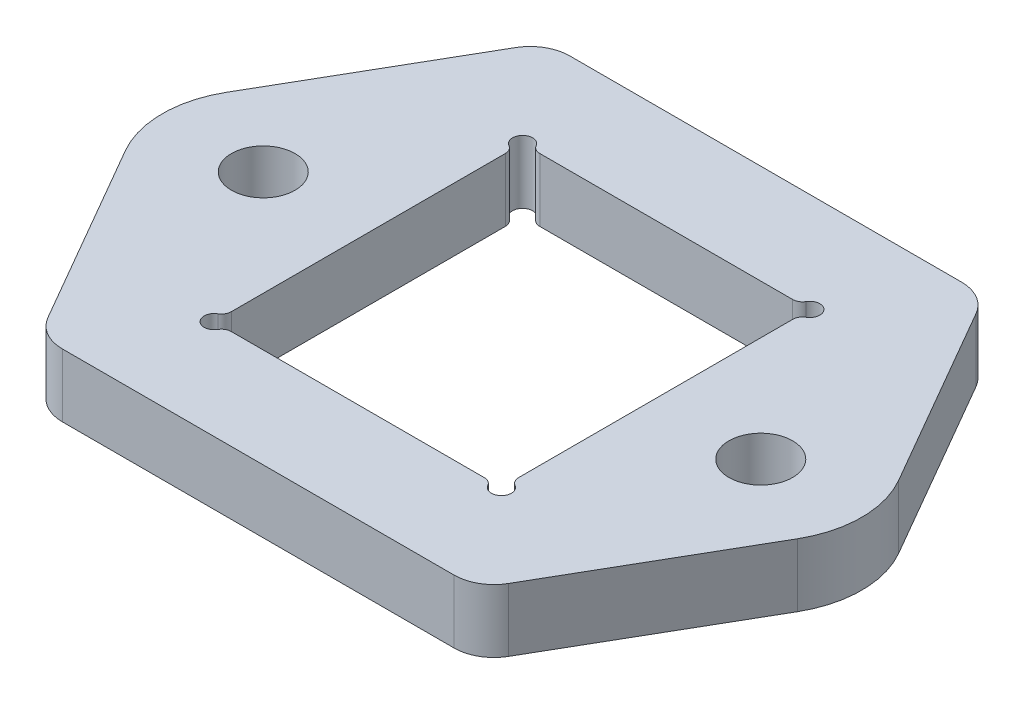
ISO-10303-21;
HEADER;
FILE_DESCRIPTION(('STEP AP214'),'2;1');
FILE_NAME('part.step','',(''),(''),'','','');
FILE_SCHEMA(('AUTOMOTIVE_DESIGN { 1 0 10303 214 1 1 1 1 }'));
ENDSEC;
DATA;
#1=APPLICATION_CONTEXT('core data for automotive mechanical design processes');
#2=APPLICATION_PROTOCOL_DEFINITION('international standard','automotive_design',2000,#1);
#3=PRODUCT_CONTEXT('',#1,'mechanical');
#4=PRODUCT('Part','Part','',(#3));
#5=PRODUCT_RELATED_PRODUCT_CATEGORY('part','',(#4));
#6=PRODUCT_DEFINITION_FORMATION('','',#4);
#7=PRODUCT_DEFINITION_CONTEXT('part definition',#1,'design');
#8=PRODUCT_DEFINITION('design','',#6,#7);
#9=PRODUCT_DEFINITION_SHAPE('','',#8);
#10=(LENGTH_UNIT() NAMED_UNIT(*) SI_UNIT(.MILLI.,.METRE.));
#11=(NAMED_UNIT(*) PLANE_ANGLE_UNIT() SI_UNIT($,.RADIAN.));
#12=(NAMED_UNIT(*) SI_UNIT($,.STERADIAN.) SOLID_ANGLE_UNIT());
#13=UNCERTAINTY_MEASURE_WITH_UNIT(LENGTH_MEASURE(1.E-05),#10,'distance_accuracy_value','');
#14=(GEOMETRIC_REPRESENTATION_CONTEXT(3) GLOBAL_UNCERTAINTY_ASSIGNED_CONTEXT((#13)) GLOBAL_UNIT_ASSIGNED_CONTEXT((#10,
#11,#12)) REPRESENTATION_CONTEXT('',''));
#15=CARTESIAN_POINT('',(0.,0.,0.));
#16=DIRECTION('',(0.,0.,1.));
#17=DIRECTION('',(1.,0.,0.));
#18=AXIS2_PLACEMENT_3D('',#15,#16,#17);
#19=CARTESIAN_POINT('',(-17.5704604773524,1.81803097578364,7.75));
#20=DIRECTION('',(0.,1.,0.));
#21=DIRECTION('',(0.,0.,1.));
#22=AXIS2_PLACEMENT_3D('',#19,#20,#21);
#23=PLANE('',#22);
#24=CARTESIAN_POINT('',(-12.5,1.81803097578364,0.));
#25=DIRECTION('',(0.,1.,0.));
#26=DIRECTION('',(0.,0.,1.));
#27=AXIS2_PLACEMENT_3D('',#24,#25,#26);
#28=CIRCLE('',#27,1.59999999999999);
#29=CARTESIAN_POINT('',(-12.5,1.81803097578364,1.59999999999999));
#30=VERTEX_POINT('',#29);
#31=EDGE_CURVE('E294',#30,#30,#28,.T.);
#32=ORIENTED_EDGE('',*,*,#31,.F.);
#33=EDGE_LOOP('',(#32));
#34=FACE_BOUND('',#33,.T.);
#35=CARTESIAN_POINT('',(12.5,1.81803097578364,0.));
#36=DIRECTION('',(0.,1.,0.));
#37=DIRECTION('',(0.,0.,1.));
#38=AXIS2_PLACEMENT_3D('',#35,#36,#37);
#39=CIRCLE('',#38,1.59999999999999);
#40=CARTESIAN_POINT('',(12.5,1.81803097578364,1.59999999999998));
#41=VERTEX_POINT('',#40);
#42=EDGE_CURVE('E309',#41,#41,#39,.T.);
#43=ORIENTED_EDGE('',*,*,#42,.F.);
#44=EDGE_LOOP('',(#43));
#45=FACE_BOUND('',#44,.T.);
#46=DIRECTION('',(0.,0.,-1.));
#47=VECTOR('',#46,1.);
#48=CARTESIAN_POINT('',(-7.21865631813423,1.81803097578364,7.75));
#49=LINE('',#48,#47);
#50=CARTESIAN_POINT('',(-7.21865631813423,1.81803097578364,6.88397459621556));
#51=VERTEX_POINT('',#50);
#52=CARTESIAN_POINT('',(-7.21865631813423,1.81803097578364,-6.88397459621556));
#53=VERTEX_POINT('',#52);
#54=EDGE_CURVE('E430',#51,#53,#49,.T.);
#55=ORIENTED_EDGE('',*,*,#54,.T.);
#56=CARTESIAN_POINT('',(-7.71865631813423,1.81803097578364,-6.88397459621556));
#57=DIRECTION('',(0.,-1.,0.));
#58=DIRECTION('',(0.,0.,-1.));
#59=AXIS2_PLACEMENT_3D('',#56,#57,#58);
#60=CIRCLE('',#59,0.5);
#61=CARTESIAN_POINT('',(-7.46865631813423,1.81803097578364,-7.31698729810778));
#62=VERTEX_POINT('',#61);
#63=EDGE_CURVE('E349',#62,#53,#60,.T.);
#64=ORIENTED_EDGE('',*,*,#63,.F.);
#65=CARTESIAN_POINT('',(-7.21865631813424,1.81803097578364,-7.75));
#66=DIRECTION('',(0.,-1.,0.));
#67=DIRECTION('',(0.,0.,-1.));
#68=AXIS2_PLACEMENT_3D('',#65,#66,#67);
#69=CIRCLE('',#68,0.5);
#70=CARTESIAN_POINT('',(-6.78564361624202,1.81803097578364,-8.));
#71=VERTEX_POINT('',#70);
#72=EDGE_CURVE('E318',#62,#71,#69,.T.);
#73=ORIENTED_EDGE('',*,*,#72,.T.);
#74=CARTESIAN_POINT('',(-6.3526309143498,1.81803097578364,-8.25));
#75=DIRECTION('',(0.,-1.,0.));
#76=DIRECTION('',(0.,0.,-1.));
#77=AXIS2_PLACEMENT_3D('',#74,#75,#76);
#78=CIRCLE('',#77,0.5);
#79=CARTESIAN_POINT('',(-6.3526309143498,1.81803097578364,-7.75));
#80=VERTEX_POINT('',#79);
#81=EDGE_CURVE('E345',#80,#71,#78,.T.);
#82=ORIENTED_EDGE('',*,*,#81,.F.);
#83=DIRECTION('',(-1.,0.,0.));
#84=VECTOR('',#83,1.);
#85=CARTESIAN_POINT('',(-17.5704604773524,1.81803097578364,-7.75));
#86=LINE('',#85,#84);
#87=CARTESIAN_POINT('',(6.3526309143498,1.81803097578364,-7.75));
#88=VERTEX_POINT('',#87);
#89=EDGE_CURVE('E337',#88,#80,#86,.T.);
#90=ORIENTED_EDGE('',*,*,#89,.F.);
#91=CARTESIAN_POINT('',(6.3526309143498,1.81803097578364,-8.25));
#92=DIRECTION('',(0.,-1.,0.));
#93=DIRECTION('',(0.,0.,-1.));
#94=AXIS2_PLACEMENT_3D('',#91,#92,#93);
#95=CIRCLE('',#94,0.5);
#96=CARTESIAN_POINT('',(6.78564361624202,1.81803097578364,-8.));
#97=VERTEX_POINT('',#96);
#98=EDGE_CURVE('E353',#97,#88,#95,.T.);
#99=ORIENTED_EDGE('',*,*,#98,.F.);
#100=CARTESIAN_POINT('',(7.21865631813423,1.81803097578364,-7.75));
#101=DIRECTION('',(0.,-1.,0.));
#102=DIRECTION('',(0.,0.,-1.));
#103=AXIS2_PLACEMENT_3D('',#100,#101,#102);
#104=CIRCLE('',#103,0.5);
#105=CARTESIAN_POINT('',(7.46865631813424,1.81803097578364,-7.31698729810778));
#106=VERTEX_POINT('',#105);
#107=EDGE_CURVE('E317',#97,#106,#104,.T.);
#108=ORIENTED_EDGE('',*,*,#107,.T.);
#109=CARTESIAN_POINT('',(7.71865631813424,1.81803097578364,-6.88397459621556));
#110=DIRECTION('',(0.,-1.,0.));
#111=DIRECTION('',(0.,0.,-1.));
#112=AXIS2_PLACEMENT_3D('',#109,#110,#111);
#113=CIRCLE('',#112,0.5);
#114=CARTESIAN_POINT('',(7.21865631813423,1.81803097578364,-6.88397459621556));
#115=VERTEX_POINT('',#114);
#116=EDGE_CURVE('E356',#115,#106,#113,.T.);
#117=ORIENTED_EDGE('',*,*,#116,.F.);
#118=DIRECTION('',(0.,0.,-1.));
#119=VECTOR('',#118,1.);
#120=CARTESIAN_POINT('',(7.21865631813423,1.81803097578364,7.75));
#121=LINE('',#120,#119);
#122=CARTESIAN_POINT('',(7.21865631813423,1.81803097578364,6.88397459621556));
#123=VERTEX_POINT('',#122);
#124=EDGE_CURVE('E409',#123,#115,#121,.T.);
#125=ORIENTED_EDGE('',*,*,#124,.F.);
#126=CARTESIAN_POINT('',(7.71865631813424,1.81803097578364,6.88397459621556));
#127=DIRECTION('',(0.,1.,0.));
#128=DIRECTION('',(0.,0.,1.));
#129=AXIS2_PLACEMENT_3D('',#126,#127,#128);
#130=CIRCLE('',#129,0.5);
#131=CARTESIAN_POINT('',(7.46865631813424,1.81803097578364,7.31698729810778));
#132=VERTEX_POINT('',#131);
#133=EDGE_CURVE('E448',#123,#132,#130,.T.);
#134=ORIENTED_EDGE('',*,*,#133,.T.);
#135=CARTESIAN_POINT('',(7.21865631813423,1.81803097578364,7.75));
#136=DIRECTION('',(0.,1.,0.));
#137=DIRECTION('',(0.,0.,1.));
#138=AXIS2_PLACEMENT_3D('',#135,#136,#137);
#139=CIRCLE('',#138,0.5);
#140=CARTESIAN_POINT('',(6.78564361624202,1.81803097578364,8.));
#141=VERTEX_POINT('',#140);
#142=EDGE_CURVE('E399',#141,#132,#139,.T.);
#143=ORIENTED_EDGE('',*,*,#142,.F.);
#144=CARTESIAN_POINT('',(6.3526309143498,1.81803097578364,8.25));
#145=DIRECTION('',(0.,1.,0.));
#146=DIRECTION('',(0.,0.,1.));
#147=AXIS2_PLACEMENT_3D('',#144,#145,#146);
#148=CIRCLE('',#147,0.5);
#149=CARTESIAN_POINT('',(6.3526309143498,1.81803097578364,7.75));
#150=VERTEX_POINT('',#149);
#151=EDGE_CURVE('E445',#141,#150,#148,.T.);
#152=ORIENTED_EDGE('',*,*,#151,.T.);
#153=DIRECTION('',(-1.,0.,0.));
#154=VECTOR('',#153,1.);
#155=CARTESIAN_POINT('',(-17.5704604773524,1.81803097578364,7.75));
#156=LINE('',#155,#154);
#157=CARTESIAN_POINT('',(-6.3526309143498,1.81803097578364,7.75));
#158=VERTEX_POINT('',#157);
#159=EDGE_CURVE('E425',#150,#158,#156,.T.);
#160=ORIENTED_EDGE('',*,*,#159,.T.);
#161=CARTESIAN_POINT('',(-6.3526309143498,1.81803097578364,8.25));
#162=DIRECTION('',(0.,1.,0.));
#163=DIRECTION('',(0.,0.,1.));
#164=AXIS2_PLACEMENT_3D('',#161,#162,#163);
#165=CIRCLE('',#164,0.5);
#166=CARTESIAN_POINT('',(-6.78564361624202,1.81803097578364,8.));
#167=VERTEX_POINT('',#166);
#168=EDGE_CURVE('E439',#158,#167,#165,.T.);
#169=ORIENTED_EDGE('',*,*,#168,.T.);
#170=CARTESIAN_POINT('',(-7.21865631813424,1.81803097578364,7.75));
#171=DIRECTION('',(0.,1.,0.));
#172=DIRECTION('',(0.,0.,1.));
#173=AXIS2_PLACEMENT_3D('',#170,#171,#172);
#174=CIRCLE('',#173,0.5);
#175=CARTESIAN_POINT('',(-7.46865631813423,1.81803097578364,7.31698729810778));
#176=VERTEX_POINT('',#175);
#177=EDGE_CURVE('E400',#176,#167,#174,.T.);
#178=ORIENTED_EDGE('',*,*,#177,.F.);
#179=CARTESIAN_POINT('',(-7.71865631813423,1.81803097578364,6.88397459621556));
#180=DIRECTION('',(0.,1.,0.));
#181=DIRECTION('',(0.,0.,1.));
#182=AXIS2_PLACEMENT_3D('',#179,#180,#181);
#183=CIRCLE('',#182,0.5);
#184=EDGE_CURVE('E442',#176,#51,#183,.T.);
#185=ORIENTED_EDGE('',*,*,#184,.T.);
#186=EDGE_LOOP('',(#55,#64,#73,#82,#90,#99,#108,#117,#125,#134,#143,#152,#160,#169,#178,#185));
#187=FACE_BOUND('',#186,.T.);
#188=DIRECTION('',(-1.,0.,0.));
#189=VECTOR('',#188,1.);
#190=CARTESIAN_POINT('',(-10.9936475108618,1.81803097578364,-12.75));
#191=LINE('',#190,#189);
#192=CARTESIAN_POINT('',(9.8389469724826,1.81803097578364,-12.75));
#193=VERTEX_POINT('',#192);
#194=CARTESIAN_POINT('',(-9.83894697248251,1.81803097578364,-12.75));
#195=VERTEX_POINT('',#194);
#196=EDGE_CURVE('E288',#193,#195,#191,.T.);
#197=ORIENTED_EDGE('',*,*,#196,.T.);
#198=CARTESIAN_POINT('',(-9.83894697248251,1.81803097578364,-10.75));
#199=DIRECTION('',(0.,1.,0.));
#200=DIRECTION('',(0.,0.,1.));
#201=AXIS2_PLACEMENT_3D('',#198,#199,#200);
#202=CIRCLE('',#201,2.);
#203=CARTESIAN_POINT('',(-11.5709977800514,1.81803097578364,-11.75));
#204=VERTEX_POINT('',#203);
#205=EDGE_CURVE('E503',#195,#204,#202,.T.);
#206=ORIENTED_EDGE('',*,*,#205,.T.);
#207=DIRECTION('',(-0.500000000000004,0.,0.866025403784436));
#208=VECTOR('',#207,1.);
#209=CARTESIAN_POINT('',(-10.9936475108618,1.81803097578364,-12.75));
#210=LINE('',#209,#208);
#211=CARTESIAN_POINT('',(-16.8911475822722,1.81803097578364,-2.53523023867622));
#212=VERTEX_POINT('',#211);
#213=EDGE_CURVE('E265',#204,#212,#210,.T.);
#214=ORIENTED_EDGE('',*,*,#213,.T.);
#215=CARTESIAN_POINT('',(-12.5,1.81803097578364,0.));
#216=DIRECTION('',(0.,1.,0.));
#217=DIRECTION('',(0.,0.,1.));
#218=AXIS2_PLACEMENT_3D('',#215,#216,#217);
#219=CIRCLE('',#218,5.07046047735241);
#220=CARTESIAN_POINT('',(-16.8911475822722,1.81803097578364,2.53523023867623));
#221=VERTEX_POINT('',#220);
#222=EDGE_CURVE('E268',#212,#221,#219,.T.);
#223=ORIENTED_EDGE('',*,*,#222,.T.);
#224=DIRECTION('',(0.500000000000005,0.,0.866025403784436));
#225=VECTOR('',#224,1.);
#226=CARTESIAN_POINT('',(-10.9936475108617,1.81803097578364,12.75));
#227=LINE('',#226,#225);
#228=CARTESIAN_POINT('',(-11.5709977800514,1.81803097578364,11.75));
#229=VERTEX_POINT('',#228);
#230=EDGE_CURVE('E271',#221,#229,#227,.T.);
#231=ORIENTED_EDGE('',*,*,#230,.T.);
#232=CARTESIAN_POINT('',(-9.8389469724825,1.81803097578364,10.75));
#233=DIRECTION('',(0.,1.,0.));
#234=DIRECTION('',(0.,0.,1.));
#235=AXIS2_PLACEMENT_3D('',#232,#233,#234);
#236=CIRCLE('',#235,2.);
#237=CARTESIAN_POINT('',(-9.8389469724825,1.81803097578364,12.75));
#238=VERTEX_POINT('',#237);
#239=EDGE_CURVE('E494',#229,#238,#236,.T.);
#240=ORIENTED_EDGE('',*,*,#239,.T.);
#241=DIRECTION('',(1.,0.,0.));
#242=VECTOR('',#241,1.);
#243=CARTESIAN_POINT('',(-10.9936475108617,1.81803097578364,12.75));
#244=LINE('',#243,#242);
#245=CARTESIAN_POINT('',(9.83894697248261,1.81803097578364,12.75));
#246=VERTEX_POINT('',#245);
#247=EDGE_CURVE('E275',#238,#246,#244,.T.);
#248=ORIENTED_EDGE('',*,*,#247,.T.);
#249=CARTESIAN_POINT('',(9.8389469724826,1.81803097578364,10.75));
#250=DIRECTION('',(0.,1.,0.));
#251=DIRECTION('',(0.,0.,1.));
#252=AXIS2_PLACEMENT_3D('',#249,#250,#251);
#253=CIRCLE('',#252,2.);
#254=CARTESIAN_POINT('',(11.5709977800515,1.81803097578364,11.75));
#255=VERTEX_POINT('',#254);
#256=EDGE_CURVE('E497',#246,#255,#253,.T.);
#257=ORIENTED_EDGE('',*,*,#256,.T.);
#258=DIRECTION('',(0.499999999999997,0.,-0.86602540378444));
#259=VECTOR('',#258,1.);
#260=CARTESIAN_POINT('',(10.9936475108619,1.81803097578364,12.75));
#261=LINE('',#260,#259);
#262=CARTESIAN_POINT('',(16.8911475822722,1.81803097578364,2.53523023867619));
#263=VERTEX_POINT('',#262);
#264=EDGE_CURVE('E279',#255,#263,#261,.T.);
#265=ORIENTED_EDGE('',*,*,#264,.T.);
#266=CARTESIAN_POINT('',(12.5,1.81803097578364,0.));
#267=DIRECTION('',(0.,1.,0.));
#268=DIRECTION('',(0.,0.,1.));
#269=AXIS2_PLACEMENT_3D('',#266,#267,#268);
#270=CIRCLE('',#269,5.07046047735241);
#271=CARTESIAN_POINT('',(16.8911475822722,1.81803097578364,-2.5352302386762));
#272=VERTEX_POINT('',#271);
#273=EDGE_CURVE('E244',#263,#272,#270,.T.);
#274=ORIENTED_EDGE('',*,*,#273,.T.);
#275=DIRECTION('',(-0.499999999999998,0.,-0.86602540378444));
#276=VECTOR('',#275,1.);
#277=CARTESIAN_POINT('',(10.9936475108619,1.81803097578364,-12.75));
#278=LINE('',#277,#276);
#279=CARTESIAN_POINT('',(11.5709977800515,1.81803097578364,-11.75));
#280=VERTEX_POINT('',#279);
#281=EDGE_CURVE('E284',#272,#280,#278,.T.);
#282=ORIENTED_EDGE('',*,*,#281,.T.);
#283=CARTESIAN_POINT('',(9.8389469724826,1.81803097578364,-10.75));
#284=DIRECTION('',(0.,1.,0.));
#285=DIRECTION('',(0.,0.,1.));
#286=AXIS2_PLACEMENT_3D('',#283,#284,#285);
#287=CIRCLE('',#286,2.);
#288=EDGE_CURVE('E500',#280,#193,#287,.T.);
#289=ORIENTED_EDGE('',*,*,#288,.T.);
#290=EDGE_LOOP('',(#197,#206,#214,#223,#231,#240,#248,#257,#265,#274,#282,#289));
#291=FACE_BOUND('',#290,.T.);
#292=ADVANCED_FACE('F41',(#34,#45,#187,#291),#23,.T.);
#293=CARTESIAN_POINT('',(-7.21865631813423,-1.35696902421636,7.75));
#294=DIRECTION('',(0.,-1.,0.));
#295=DIRECTION('',(1.,0.,0.));
#296=AXIS2_PLACEMENT_3D('',#293,#294,#295);
#297=PLANE('',#296);
#298=CARTESIAN_POINT('',(-12.5,-1.35696902421636,0.));
#299=DIRECTION('',(0.,1.,0.));
#300=DIRECTION('',(0.,0.,1.));
#301=AXIS2_PLACEMENT_3D('',#298,#299,#300);
#302=CIRCLE('',#301,1.6);
#303=CARTESIAN_POINT('',(-12.5,-1.35696902421636,1.6));
#304=VERTEX_POINT('',#303);
#305=EDGE_CURVE('E305',#304,#304,#302,.T.);
#306=ORIENTED_EDGE('',*,*,#305,.T.);
#307=EDGE_LOOP('',(#306));
#308=FACE_BOUND('',#307,.T.);
#309=CARTESIAN_POINT('',(12.5,-1.35696902421636,0.));
#310=DIRECTION('',(0.,1.,0.));
#311=DIRECTION('',(0.,0.,1.));
#312=AXIS2_PLACEMENT_3D('',#309,#310,#311);
#313=CIRCLE('',#312,1.6);
#314=CARTESIAN_POINT('',(12.5,-1.35696902421636,1.59999999999999));
#315=VERTEX_POINT('',#314);
#316=EDGE_CURVE('E313',#315,#315,#313,.T.);
#317=ORIENTED_EDGE('',*,*,#316,.T.);
#318=EDGE_LOOP('',(#317));
#319=FACE_BOUND('',#318,.T.);
#320=CARTESIAN_POINT('',(7.21865631813423,-1.35696902421636,7.75));
#321=DIRECTION('',(0.,-1.,0.));
#322=DIRECTION('',(1.,0.,0.));
#323=AXIS2_PLACEMENT_3D('',#320,#321,#322);
#324=CIRCLE('',#323,0.5);
#325=CARTESIAN_POINT('',(6.78564361624202,-1.35696902421636,8.));
#326=VERTEX_POINT('',#325);
#327=CARTESIAN_POINT('',(7.46865631813424,-1.35696902421636,7.31698729810778));
#328=VERTEX_POINT('',#327);
#329=EDGE_CURVE('E405',#326,#328,#324,.F.);
#330=ORIENTED_EDGE('',*,*,#329,.T.);
#331=CARTESIAN_POINT('',(7.71865631813424,-1.35696902421636,6.88397459621556));
#332=DIRECTION('',(0.,-1.,0.));
#333=DIRECTION('',(1.,0.,0.));
#334=AXIS2_PLACEMENT_3D('',#331,#332,#333);
#335=CIRCLE('',#334,0.5);
#336=CARTESIAN_POINT('',(7.21865631813423,-1.35696902421636,6.88397459621556));
#337=VERTEX_POINT('',#336);
#338=EDGE_CURVE('E467',#328,#337,#335,.T.);
#339=ORIENTED_EDGE('',*,*,#338,.T.);
#340=DIRECTION('',(0.,0.,-1.));
#341=VECTOR('',#340,1.);
#342=CARTESIAN_POINT('',(7.21865631813423,-1.35696902421636,7.75));
#343=LINE('',#342,#341);
#344=CARTESIAN_POINT('',(7.21865631813423,-1.35696902421636,-6.88397459621556));
#345=VERTEX_POINT('',#344);
#346=EDGE_CURVE('E418',#337,#345,#343,.T.);
#347=ORIENTED_EDGE('',*,*,#346,.T.);
#348=CARTESIAN_POINT('',(7.71865631813424,-1.35696902421636,-6.88397459621556));
#349=DIRECTION('',(0.,1.,0.));
#350=DIRECTION('',(1.,0.,0.));
#351=AXIS2_PLACEMENT_3D('',#348,#349,#350);
#352=CIRCLE('',#351,0.5);
#353=CARTESIAN_POINT('',(7.46865631813424,-1.35696902421636,-7.31698729810778));
#354=VERTEX_POINT('',#353);
#355=EDGE_CURVE('E377',#354,#345,#352,.T.);
#356=ORIENTED_EDGE('',*,*,#355,.F.);
#357=CARTESIAN_POINT('',(7.21865631813423,-1.35696902421636,-7.75));
#358=DIRECTION('',(0.,1.,0.));
#359=DIRECTION('',(1.,0.,0.));
#360=AXIS2_PLACEMENT_3D('',#357,#358,#359);
#361=CIRCLE('',#360,0.5);
#362=CARTESIAN_POINT('',(6.78564361624202,-1.35696902421636,-8.));
#363=VERTEX_POINT('',#362);
#364=EDGE_CURVE('E323',#363,#354,#361,.F.);
#365=ORIENTED_EDGE('',*,*,#364,.F.);
#366=CARTESIAN_POINT('',(6.3526309143498,-1.35696902421636,-8.25));
#367=DIRECTION('',(0.,1.,0.));
#368=DIRECTION('',(1.,0.,0.));
#369=AXIS2_PLACEMENT_3D('',#366,#367,#368);
#370=CIRCLE('',#369,0.5);
#371=CARTESIAN_POINT('',(6.3526309143498,-1.35696902421636,-7.75));
#372=VERTEX_POINT('',#371);
#373=EDGE_CURVE('E373',#372,#363,#370,.T.);
#374=ORIENTED_EDGE('',*,*,#373,.F.);
#375=DIRECTION('',(1.,0.,0.));
#376=VECTOR('',#375,1.);
#377=CARTESIAN_POINT('',(-17.5704604773524,-1.35696902421636,-7.75));
#378=LINE('',#377,#376);
#379=CARTESIAN_POINT('',(-6.3526309143498,-1.35696902421636,-7.75));
#380=VERTEX_POINT('',#379);
#381=EDGE_CURVE('E327',#380,#372,#378,.T.);
#382=ORIENTED_EDGE('',*,*,#381,.F.);
#383=CARTESIAN_POINT('',(-6.3526309143498,-1.35696902421636,-8.25));
#384=DIRECTION('',(0.,1.,0.));
#385=DIRECTION('',(1.,0.,0.));
#386=AXIS2_PLACEMENT_3D('',#383,#384,#385);
#387=CIRCLE('',#386,0.5);
#388=CARTESIAN_POINT('',(-6.78564361624202,-1.35696902421636,-8.));
#389=VERTEX_POINT('',#388);
#390=EDGE_CURVE('E366',#389,#380,#387,.T.);
#391=ORIENTED_EDGE('',*,*,#390,.F.);
#392=CARTESIAN_POINT('',(-7.21865631813424,-1.35696902421636,-7.75));
#393=DIRECTION('',(0.,1.,0.));
#394=DIRECTION('',(1.,0.,0.));
#395=AXIS2_PLACEMENT_3D('',#392,#393,#394);
#396=CIRCLE('',#395,0.5);
#397=CARTESIAN_POINT('',(-7.46865631813423,-1.35696902421636,-7.31698729810778));
#398=VERTEX_POINT('',#397);
#399=EDGE_CURVE('E322',#398,#389,#396,.F.);
#400=ORIENTED_EDGE('',*,*,#399,.F.);
#401=CARTESIAN_POINT('',(-7.71865631813423,-1.35696902421636,-6.88397459621556));
#402=DIRECTION('',(0.,1.,0.));
#403=DIRECTION('',(1.,0.,0.));
#404=AXIS2_PLACEMENT_3D('',#401,#402,#403);
#405=CIRCLE('',#404,0.5);
#406=CARTESIAN_POINT('',(-7.21865631813423,-1.35696902421636,-6.88397459621556));
#407=VERTEX_POINT('',#406);
#408=EDGE_CURVE('E369',#407,#398,#405,.T.);
#409=ORIENTED_EDGE('',*,*,#408,.F.);
#410=DIRECTION('',(0.,0.,-1.));
#411=VECTOR('',#410,1.);
#412=CARTESIAN_POINT('',(-7.21865631813423,-1.35696902421636,7.75));
#413=LINE('',#412,#411);
#414=CARTESIAN_POINT('',(-7.21865631813423,-1.35696902421636,6.88397459621556));
#415=VERTEX_POINT('',#414);
#416=EDGE_CURVE('E429',#415,#407,#413,.T.);
#417=ORIENTED_EDGE('',*,*,#416,.F.);
#418=CARTESIAN_POINT('',(-7.71865631813423,-1.35696902421636,6.88397459621556));
#419=DIRECTION('',(0.,-1.,0.));
#420=DIRECTION('',(1.,0.,0.));
#421=AXIS2_PLACEMENT_3D('',#418,#419,#420);
#422=CIRCLE('',#421,0.5);
#423=CARTESIAN_POINT('',(-7.46865631813423,-1.35696902421636,7.31698729810778));
#424=VERTEX_POINT('',#423);
#425=EDGE_CURVE('E461',#415,#424,#422,.T.);
#426=ORIENTED_EDGE('',*,*,#425,.T.);
#427=CARTESIAN_POINT('',(-7.21865631813424,-1.35696902421636,7.75));
#428=DIRECTION('',(0.,-1.,0.));
#429=DIRECTION('',(1.,0.,0.));
#430=AXIS2_PLACEMENT_3D('',#427,#428,#429);
#431=CIRCLE('',#430,0.5);
#432=CARTESIAN_POINT('',(-6.78564361624202,-1.35696902421636,8.));
#433=VERTEX_POINT('',#432);
#434=EDGE_CURVE('E404',#424,#433,#431,.F.);
#435=ORIENTED_EDGE('',*,*,#434,.T.);
#436=CARTESIAN_POINT('',(-6.3526309143498,-1.35696902421636,8.25));
#437=DIRECTION('',(0.,-1.,0.));
#438=DIRECTION('',(1.,0.,0.));
#439=AXIS2_PLACEMENT_3D('',#436,#437,#438);
#440=CIRCLE('',#439,0.5);
#441=CARTESIAN_POINT('',(-6.3526309143498,-1.35696902421636,7.75));
#442=VERTEX_POINT('',#441);
#443=EDGE_CURVE('E458',#433,#442,#440,.T.);
#444=ORIENTED_EDGE('',*,*,#443,.T.);
#445=DIRECTION('',(1.,0.,0.));
#446=VECTOR('',#445,1.);
#447=CARTESIAN_POINT('',(-17.5704604773524,-1.35696902421636,7.75));
#448=LINE('',#447,#446);
#449=CARTESIAN_POINT('',(6.3526309143498,-1.35696902421636,7.75));
#450=VERTEX_POINT('',#449);
#451=EDGE_CURVE('E421',#442,#450,#448,.T.);
#452=ORIENTED_EDGE('',*,*,#451,.T.);
#453=CARTESIAN_POINT('',(6.3526309143498,-1.35696902421636,8.25));
#454=DIRECTION('',(0.,-1.,0.));
#455=DIRECTION('',(1.,0.,0.));
#456=AXIS2_PLACEMENT_3D('',#453,#454,#455);
#457=CIRCLE('',#456,0.5);
#458=EDGE_CURVE('E464',#450,#326,#457,.T.);
#459=ORIENTED_EDGE('',*,*,#458,.T.);
#460=EDGE_LOOP('',(#330,#339,#347,#356,#365,#374,#382,#391,#400,#409,#417,#426,#435,#444,#452,#459));
#461=FACE_BOUND('',#460,.T.);
#462=DIRECTION('',(-0.500000000000004,0.,0.866025403784436));
#463=VECTOR('',#462,1.);
#464=CARTESIAN_POINT('',(-10.9936475108618,-1.35696902421636,-12.75));
#465=LINE('',#464,#463);
#466=CARTESIAN_POINT('',(-11.5709977800514,-1.35696902421636,-11.75));
#467=VERTEX_POINT('',#466);
#468=CARTESIAN_POINT('',(-16.8911475822722,-1.35696902421636,-2.53523023867622));
#469=VERTEX_POINT('',#468);
#470=EDGE_CURVE('E292',#467,#469,#465,.T.);
#471=ORIENTED_EDGE('',*,*,#470,.F.);
#472=CARTESIAN_POINT('',(-9.83894697248251,-1.35696902421636,-10.75));
#473=DIRECTION('',(0.,-1.,0.));
#474=DIRECTION('',(1.,0.,0.));
#475=AXIS2_PLACEMENT_3D('',#472,#473,#474);
#476=CIRCLE('',#475,2.);
#477=CARTESIAN_POINT('',(-9.83894697248251,-1.35696902421636,-12.75));
#478=VERTEX_POINT('',#477);
#479=EDGE_CURVE('E516',#467,#478,#476,.T.);
#480=ORIENTED_EDGE('',*,*,#479,.T.);
#481=DIRECTION('',(-1.,0.,0.));
#482=VECTOR('',#481,1.);
#483=CARTESIAN_POINT('',(-10.9936475108618,-1.35696902421636,-12.75));
#484=LINE('',#483,#482);
#485=CARTESIAN_POINT('',(9.8389469724826,-1.35696902421636,-12.75));
#486=VERTEX_POINT('',#485);
#487=EDGE_CURVE('E257',#486,#478,#484,.T.);
#488=ORIENTED_EDGE('',*,*,#487,.F.);
#489=CARTESIAN_POINT('',(9.8389469724826,-1.35696902421636,-10.75));
#490=DIRECTION('',(0.,-1.,0.));
#491=DIRECTION('',(1.,0.,0.));
#492=AXIS2_PLACEMENT_3D('',#489,#490,#491);
#493=CIRCLE('',#492,2.);
#494=CARTESIAN_POINT('',(11.5709977800515,-1.35696902421636,-11.75));
#495=VERTEX_POINT('',#494);
#496=EDGE_CURVE('E513',#486,#495,#493,.T.);
#497=ORIENTED_EDGE('',*,*,#496,.T.);
#498=DIRECTION('',(-0.499999999999998,0.,-0.86602540378444));
#499=VECTOR('',#498,1.);
#500=CARTESIAN_POINT('',(10.9936475108619,-1.35696902421636,-12.75));
#501=LINE('',#500,#499);
#502=CARTESIAN_POINT('',(16.8911475822722,-1.35696902421636,-2.5352302386762));
#503=VERTEX_POINT('',#502);
#504=EDGE_CURVE('E253',#503,#495,#501,.T.);
#505=ORIENTED_EDGE('',*,*,#504,.F.);
#506=CARTESIAN_POINT('',(12.5,-1.35696902421636,0.));
#507=DIRECTION('',(0.,1.,0.));
#508=DIRECTION('',(0.,0.,1.));
#509=AXIS2_PLACEMENT_3D('',#506,#507,#508);
#510=CIRCLE('',#509,5.07046047735241);
#511=CARTESIAN_POINT('',(16.8911475822722,-1.35696902421636,2.53523023867619));
#512=VERTEX_POINT('',#511);
#513=EDGE_CURVE('E237',#512,#503,#510,.T.);
#514=ORIENTED_EDGE('',*,*,#513,.F.);
#515=DIRECTION('',(0.499999999999997,0.,-0.86602540378444));
#516=VECTOR('',#515,1.);
#517=CARTESIAN_POINT('',(10.9936475108619,-1.35696902421636,12.75));
#518=LINE('',#517,#516);
#519=CARTESIAN_POINT('',(11.5709977800515,-1.35696902421636,11.75));
#520=VERTEX_POINT('',#519);
#521=EDGE_CURVE('E228',#520,#512,#518,.T.);
#522=ORIENTED_EDGE('',*,*,#521,.F.);
#523=CARTESIAN_POINT('',(9.8389469724826,-1.35696902421636,10.75));
#524=DIRECTION('',(0.,-1.,0.));
#525=DIRECTION('',(1.,0.,0.));
#526=AXIS2_PLACEMENT_3D('',#523,#524,#525);
#527=CIRCLE('',#526,2.);
#528=CARTESIAN_POINT('',(9.83894697248261,-1.35696902421636,12.75));
#529=VERTEX_POINT('',#528);
#530=EDGE_CURVE('E63',#520,#529,#527,.T.);
#531=ORIENTED_EDGE('',*,*,#530,.T.);
#532=DIRECTION('',(1.,0.,0.));
#533=VECTOR('',#532,1.);
#534=CARTESIAN_POINT('',(-10.9936475108617,-1.35696902421636,12.75));
#535=LINE('',#534,#533);
#536=CARTESIAN_POINT('',(-9.8389469724825,-1.35696902421636,12.75));
#537=VERTEX_POINT('',#536);
#538=EDGE_CURVE('E238',#537,#529,#535,.T.);
#539=ORIENTED_EDGE('',*,*,#538,.F.);
#540=CARTESIAN_POINT('',(-9.8389469724825,-1.35696902421636,10.75));
#541=DIRECTION('',(0.,-1.,0.));
#542=DIRECTION('',(1.,0.,0.));
#543=AXIS2_PLACEMENT_3D('',#540,#541,#542);
#544=CIRCLE('',#543,2.);
#545=CARTESIAN_POINT('',(-11.5709977800514,-1.35696902421636,11.75));
#546=VERTEX_POINT('',#545);
#547=EDGE_CURVE('E57',#537,#546,#544,.T.);
#548=ORIENTED_EDGE('',*,*,#547,.T.);
#549=DIRECTION('',(0.500000000000005,0.,0.866025403784436));
#550=VECTOR('',#549,1.);
#551=CARTESIAN_POINT('',(-10.9936475108617,-1.35696902421636,12.75));
#552=LINE('',#551,#550);
#553=CARTESIAN_POINT('',(-16.8911475822722,-1.35696902421636,2.53523023867623));
#554=VERTEX_POINT('',#553);
#555=EDGE_CURVE('E543',#554,#546,#552,.T.);
#556=ORIENTED_EDGE('',*,*,#555,.F.);
#557=CARTESIAN_POINT('',(-12.5,-1.35696902421636,0.));
#558=DIRECTION('',(0.,1.,0.));
#559=DIRECTION('',(0.,0.,1.));
#560=AXIS2_PLACEMENT_3D('',#557,#558,#559);
#561=CIRCLE('',#560,5.07046047735241);
#562=EDGE_CURVE('E546',#469,#554,#561,.T.);
#563=ORIENTED_EDGE('',*,*,#562,.F.);
#564=EDGE_LOOP('',(#471,#480,#488,#497,#505,#514,#522,#531,#539,#548,#556,#563));
#565=FACE_BOUND('',#564,.T.);
#566=ADVANCED_FACE('F251',(#308,#319,#461,#565),#297,.T.);
#567=CARTESIAN_POINT('',(0.,0.,7.75));
#568=DIRECTION('',(0.,0.,-1.));
#569=DIRECTION('',(-1.,0.,0.));
#570=AXIS2_PLACEMENT_3D('',#567,#568,#569);
#571=PLANE('',#570);
#572=ORIENTED_EDGE('',*,*,#159,.F.);
#573=DIRECTION('',(0.,-1.,0.));
#574=VECTOR('',#573,1.);
#575=CARTESIAN_POINT('',(6.3526309143498,-1.35696902421636,7.75));
#576=LINE('',#575,#574);
#577=EDGE_CURVE('E473',#150,#450,#576,.T.);
#578=ORIENTED_EDGE('',*,*,#577,.T.);
#579=ORIENTED_EDGE('',*,*,#451,.F.);
#580=DIRECTION('',(0.,-1.,0.));
#581=VECTOR('',#580,1.);
#582=CARTESIAN_POINT('',(-6.3526309143498,1.81803097578364,7.75));
#583=LINE('',#582,#581);
#584=EDGE_CURVE('E470',#442,#158,#583,.F.);
#585=ORIENTED_EDGE('',*,*,#584,.T.);
#586=EDGE_LOOP('',(#572,#578,#579,#585));
#587=FACE_BOUND('',#586,.T.);
#588=ADVANCED_FACE('F591',(#587),#571,.T.);
#589=CARTESIAN_POINT('',(-7.21865631813423,1.81803097578364,7.75));
#590=DIRECTION('',(1.,0.,0.));
#591=DIRECTION('',(0.,1.,0.));
#592=AXIS2_PLACEMENT_3D('',#589,#590,#591);
#593=PLANE('',#592);
#594=ORIENTED_EDGE('',*,*,#54,.F.);
#595=DIRECTION('',(0.,-1.,0.));
#596=VECTOR('',#595,1.);
#597=CARTESIAN_POINT('',(-7.21865631813423,-1.35696902421636,6.88397459621556));
#598=LINE('',#597,#596);
#599=EDGE_CURVE('E484',#51,#415,#598,.T.);
#600=ORIENTED_EDGE('',*,*,#599,.T.);
#601=ORIENTED_EDGE('',*,*,#416,.T.);
#602=DIRECTION('',(0.,-1.,0.));
#603=VECTOR('',#602,1.);
#604=CARTESIAN_POINT('',(-7.21865631813423,-1.35696902421636,-6.88397459621556));
#605=LINE('',#604,#603);
#606=EDGE_CURVE('E395',#53,#407,#605,.T.);
#607=ORIENTED_EDGE('',*,*,#606,.F.);
#608=EDGE_LOOP('',(#594,#600,#601,#607));
#609=FACE_BOUND('',#608,.T.);
#610=ADVANCED_FACE('F599',(#609),#593,.T.);
#611=CARTESIAN_POINT('',(7.21865631813423,1.81803097578364,7.75));
#612=DIRECTION('',(1.,0.,0.));
#613=DIRECTION('',(0.,1.,0.));
#614=AXIS2_PLACEMENT_3D('',#611,#612,#613);
#615=PLANE('',#614);
#616=ORIENTED_EDGE('',*,*,#346,.F.);
#617=DIRECTION('',(0.,1.,0.));
#618=VECTOR('',#617,1.);
#619=CARTESIAN_POINT('',(7.21865631813423,1.81803097578364,6.88397459621556));
#620=LINE('',#619,#618);
#621=EDGE_CURVE('E433',#337,#123,#620,.T.);
#622=ORIENTED_EDGE('',*,*,#621,.T.);
#623=ORIENTED_EDGE('',*,*,#124,.T.);
#624=DIRECTION('',(0.,1.,0.));
#625=VECTOR('',#624,1.);
#626=CARTESIAN_POINT('',(7.21865631813423,1.81803097578364,-6.88397459621556));
#627=LINE('',#626,#625);
#628=EDGE_CURVE('E341',#345,#115,#627,.T.);
#629=ORIENTED_EDGE('',*,*,#628,.F.);
#630=EDGE_LOOP('',(#616,#622,#623,#629));
#631=FACE_BOUND('',#630,.T.);
#632=ADVANCED_FACE('F601',(#631),#615,.F.);
#633=CARTESIAN_POINT('',(7.21865631813423,-2.77118258658946,7.75));
#634=DIRECTION('',(0.,1.,0.));
#635=DIRECTION('',(0.,0.,1.));
#636=AXIS2_PLACEMENT_3D('',#633,#634,#635);
#637=CYLINDRICAL_SURFACE('',#636,0.5);
#638=ORIENTED_EDGE('',*,*,#142,.T.);
#639=DIRECTION('',(0.,1.,0.));
#640=VECTOR('',#639,1.);
#641=CARTESIAN_POINT('',(7.46865631813424,-2.77118258658946,7.31698729810778));
#642=LINE('',#641,#640);
#643=EDGE_CURVE('E455',#132,#328,#642,.F.);
#644=ORIENTED_EDGE('',*,*,#643,.T.);
#645=ORIENTED_EDGE('',*,*,#329,.F.);
#646=DIRECTION('',(0.,1.,0.));
#647=VECTOR('',#646,1.);
#648=CARTESIAN_POINT('',(6.78564361624202,-2.77118258658946,8.));
#649=LINE('',#648,#647);
#650=EDGE_CURVE('E451',#326,#141,#649,.T.);
#651=ORIENTED_EDGE('',*,*,#650,.T.);
#652=EDGE_LOOP('',(#638,#644,#645,#651));
#653=FACE_BOUND('',#652,.T.);
#654=ADVANCED_FACE('F674',(#653),#637,.F.);
#655=CARTESIAN_POINT('',(-7.21865631813424,-2.77118258658946,7.75));
#656=DIRECTION('',(0.,1.,0.));
#657=DIRECTION('',(0.,0.,1.));
#658=AXIS2_PLACEMENT_3D('',#655,#656,#657);
#659=CYLINDRICAL_SURFACE('',#658,0.5);
#660=ORIENTED_EDGE('',*,*,#434,.F.);
#661=DIRECTION('',(0.,1.,0.));
#662=VECTOR('',#661,1.);
#663=CARTESIAN_POINT('',(-7.46865631813423,-2.77118258658946,7.31698729810778));
#664=LINE('',#663,#662);
#665=EDGE_CURVE('E480',#424,#176,#664,.T.);
#666=ORIENTED_EDGE('',*,*,#665,.T.);
#667=ORIENTED_EDGE('',*,*,#177,.T.);
#668=DIRECTION('',(0.,1.,0.));
#669=VECTOR('',#668,1.);
#670=CARTESIAN_POINT('',(-6.78564361624202,-2.77118258658946,8.));
#671=LINE('',#670,#669);
#672=EDGE_CURVE('E476',#167,#433,#671,.F.);
#673=ORIENTED_EDGE('',*,*,#672,.T.);
#674=EDGE_LOOP('',(#660,#666,#667,#673));
#675=FACE_BOUND('',#674,.T.);
#676=ADVANCED_FACE('F608',(#675),#659,.F.);
#677=CARTESIAN_POINT('',(7.71865631813424,-2.77118258658945,6.88397459621556));
#678=DIRECTION('',(0.,1.,0.));
#679=DIRECTION('',(0.,0.,1.));
#680=AXIS2_PLACEMENT_3D('',#677,#678,#679);
#681=CYLINDRICAL_SURFACE('',#680,0.5);
#682=ORIENTED_EDGE('',*,*,#338,.F.);
#683=ORIENTED_EDGE('',*,*,#643,.F.);
#684=ORIENTED_EDGE('',*,*,#133,.F.);
#685=ORIENTED_EDGE('',*,*,#621,.F.);
#686=EDGE_LOOP('',(#682,#683,#684,#685));
#687=FACE_BOUND('',#686,.T.);
#688=ADVANCED_FACE('F604',(#687),#681,.T.);
#689=CARTESIAN_POINT('',(6.3526309143498,-2.77118258658946,8.25));
#690=DIRECTION('',(0.,1.,0.));
#691=DIRECTION('',(0.,0.,1.));
#692=AXIS2_PLACEMENT_3D('',#689,#690,#691);
#693=CYLINDRICAL_SURFACE('',#692,0.5);
#694=ORIENTED_EDGE('',*,*,#458,.F.);
#695=ORIENTED_EDGE('',*,*,#577,.F.);
#696=ORIENTED_EDGE('',*,*,#151,.F.);
#697=ORIENTED_EDGE('',*,*,#650,.F.);
#698=EDGE_LOOP('',(#694,#695,#696,#697));
#699=FACE_BOUND('',#698,.T.);
#700=ADVANCED_FACE('F607',(#699),#693,.T.);
#701=CARTESIAN_POINT('',(-7.71865631813423,-2.77118258658946,6.88397459621556));
#702=DIRECTION('',(0.,1.,0.));
#703=DIRECTION('',(0.,0.,1.));
#704=AXIS2_PLACEMENT_3D('',#701,#702,#703);
#705=CYLINDRICAL_SURFACE('',#704,0.5);
#706=ORIENTED_EDGE('',*,*,#425,.F.);
#707=ORIENTED_EDGE('',*,*,#599,.F.);
#708=ORIENTED_EDGE('',*,*,#184,.F.);
#709=ORIENTED_EDGE('',*,*,#665,.F.);
#710=EDGE_LOOP('',(#706,#707,#708,#709));
#711=FACE_BOUND('',#710,.T.);
#712=ADVANCED_FACE('F612',(#711),#705,.T.);
#713=CARTESIAN_POINT('',(-6.3526309143498,-2.77118258658946,8.25));
#714=DIRECTION('',(0.,1.,0.));
#715=DIRECTION('',(0.,0.,1.));
#716=AXIS2_PLACEMENT_3D('',#713,#714,#715);
#717=CYLINDRICAL_SURFACE('',#716,0.5);
#718=ORIENTED_EDGE('',*,*,#168,.F.);
#719=ORIENTED_EDGE('',*,*,#584,.F.);
#720=ORIENTED_EDGE('',*,*,#443,.F.);
#721=ORIENTED_EDGE('',*,*,#672,.F.);
#722=EDGE_LOOP('',(#718,#719,#720,#721));
#723=FACE_BOUND('',#722,.T.);
#724=ADVANCED_FACE('F616',(#723),#717,.T.);
#725=CARTESIAN_POINT('',(0.,0.,-7.75));
#726=DIRECTION('',(0.,0.,1.));
#727=DIRECTION('',(-1.,0.,0.));
#728=AXIS2_PLACEMENT_3D('',#725,#726,#727);
#729=PLANE('',#728);
#730=ORIENTED_EDGE('',*,*,#89,.T.);
#731=DIRECTION('',(0.,-1.,0.));
#732=VECTOR('',#731,1.);
#733=CARTESIAN_POINT('',(-6.3526309143498,1.81803097578364,-7.75));
#734=LINE('',#733,#732);
#735=EDGE_CURVE('E381',#380,#80,#734,.F.);
#736=ORIENTED_EDGE('',*,*,#735,.F.);
#737=ORIENTED_EDGE('',*,*,#381,.T.);
#738=DIRECTION('',(0.,-1.,0.));
#739=VECTOR('',#738,1.);
#740=CARTESIAN_POINT('',(6.3526309143498,-1.35696902421636,-7.75));
#741=LINE('',#740,#739);
#742=EDGE_CURVE('E385',#88,#372,#741,.T.);
#743=ORIENTED_EDGE('',*,*,#742,.F.);
#744=EDGE_LOOP('',(#730,#736,#737,#743));
#745=FACE_BOUND('',#744,.T.);
#746=ADVANCED_FACE('F620',(#745),#729,.T.);
#747=CARTESIAN_POINT('',(7.21865631813423,-2.77118258658946,-7.75));
#748=DIRECTION('',(0.,1.,0.));
#749=DIRECTION('',(0.,0.,-1.));
#750=AXIS2_PLACEMENT_3D('',#747,#748,#749);
#751=CYLINDRICAL_SURFACE('',#750,0.5);
#752=ORIENTED_EDGE('',*,*,#107,.F.);
#753=DIRECTION('',(0.,1.,0.));
#754=VECTOR('',#753,1.);
#755=CARTESIAN_POINT('',(6.78564361624202,-2.77118258658946,-8.));
#756=LINE('',#755,#754);
#757=EDGE_CURVE('E360',#363,#97,#756,.T.);
#758=ORIENTED_EDGE('',*,*,#757,.F.);
#759=ORIENTED_EDGE('',*,*,#364,.T.);
#760=DIRECTION('',(0.,1.,0.));
#761=VECTOR('',#760,1.);
#762=CARTESIAN_POINT('',(7.46865631813424,-2.77118258658946,-7.31698729810778));
#763=LINE('',#762,#761);
#764=EDGE_CURVE('E363',#106,#354,#763,.F.);
#765=ORIENTED_EDGE('',*,*,#764,.F.);
#766=EDGE_LOOP('',(#752,#758,#759,#765));
#767=FACE_BOUND('',#766,.T.);
#768=ADVANCED_FACE('F650',(#767),#751,.F.);
#769=CARTESIAN_POINT('',(-7.21865631813424,-2.77118258658946,-7.75));
#770=DIRECTION('',(0.,1.,0.));
#771=DIRECTION('',(0.,0.,-1.));
#772=AXIS2_PLACEMENT_3D('',#769,#770,#771);
#773=CYLINDRICAL_SURFACE('',#772,0.5);
#774=ORIENTED_EDGE('',*,*,#399,.T.);
#775=DIRECTION('',(0.,1.,0.));
#776=VECTOR('',#775,1.);
#777=CARTESIAN_POINT('',(-6.78564361624202,-2.77118258658946,-8.));
#778=LINE('',#777,#776);
#779=EDGE_CURVE('E389',#71,#389,#778,.F.);
#780=ORIENTED_EDGE('',*,*,#779,.F.);
#781=ORIENTED_EDGE('',*,*,#72,.F.);
#782=DIRECTION('',(0.,1.,0.));
#783=VECTOR('',#782,1.);
#784=CARTESIAN_POINT('',(-7.46865631813423,-2.77118258658946,-7.31698729810778));
#785=LINE('',#784,#783);
#786=EDGE_CURVE('E392',#398,#62,#785,.T.);
#787=ORIENTED_EDGE('',*,*,#786,.F.);
#788=EDGE_LOOP('',(#774,#780,#781,#787));
#789=FACE_BOUND('',#788,.T.);
#790=ADVANCED_FACE('F646',(#789),#773,.F.);
#791=CARTESIAN_POINT('',(7.71865631813424,-2.77118258658945,-6.88397459621556));
#792=DIRECTION('',(0.,1.,0.));
#793=DIRECTION('',(0.,0.,-1.));
#794=AXIS2_PLACEMENT_3D('',#791,#792,#793);
#795=CYLINDRICAL_SURFACE('',#794,0.5);
#796=ORIENTED_EDGE('',*,*,#355,.T.);
#797=ORIENTED_EDGE('',*,*,#628,.T.);
#798=ORIENTED_EDGE('',*,*,#116,.T.);
#799=ORIENTED_EDGE('',*,*,#764,.T.);
#800=EDGE_LOOP('',(#796,#797,#798,#799));
#801=FACE_BOUND('',#800,.T.);
#802=ADVANCED_FACE('F649',(#801),#795,.T.);
#803=CARTESIAN_POINT('',(6.3526309143498,-2.77118258658946,-8.25));
#804=DIRECTION('',(0.,1.,0.));
#805=DIRECTION('',(0.,0.,-1.));
#806=AXIS2_PLACEMENT_3D('',#803,#804,#805);
#807=CYLINDRICAL_SURFACE('',#806,0.5);
#808=ORIENTED_EDGE('',*,*,#373,.T.);
#809=ORIENTED_EDGE('',*,*,#757,.T.);
#810=ORIENTED_EDGE('',*,*,#98,.T.);
#811=ORIENTED_EDGE('',*,*,#742,.T.);
#812=EDGE_LOOP('',(#808,#809,#810,#811));
#813=FACE_BOUND('',#812,.T.);
#814=ADVANCED_FACE('F660',(#813),#807,.T.);
#815=CARTESIAN_POINT('',(-7.71865631813423,-2.77118258658946,-6.88397459621556));
#816=DIRECTION('',(0.,1.,0.));
#817=DIRECTION('',(0.,0.,-1.));
#818=AXIS2_PLACEMENT_3D('',#815,#816,#817);
#819=CYLINDRICAL_SURFACE('',#818,0.5);
#820=ORIENTED_EDGE('',*,*,#408,.T.);
#821=ORIENTED_EDGE('',*,*,#786,.T.);
#822=ORIENTED_EDGE('',*,*,#63,.T.);
#823=ORIENTED_EDGE('',*,*,#606,.T.);
#824=EDGE_LOOP('',(#820,#821,#822,#823));
#825=FACE_BOUND('',#824,.T.);
#826=ADVANCED_FACE('F664',(#825),#819,.T.);
#827=CARTESIAN_POINT('',(-6.3526309143498,-2.77118258658946,-8.25));
#828=DIRECTION('',(0.,1.,0.));
#829=DIRECTION('',(0.,0.,-1.));
#830=AXIS2_PLACEMENT_3D('',#827,#828,#829);
#831=CYLINDRICAL_SURFACE('',#830,0.5);
#832=ORIENTED_EDGE('',*,*,#81,.T.);
#833=ORIENTED_EDGE('',*,*,#779,.T.);
#834=ORIENTED_EDGE('',*,*,#390,.T.);
#835=ORIENTED_EDGE('',*,*,#735,.T.);
#836=EDGE_LOOP('',(#832,#833,#834,#835));
#837=FACE_BOUND('',#836,.T.);
#838=ADVANCED_FACE('F644',(#837),#831,.T.);
#839=CARTESIAN_POINT('',(12.5,1.81803097578364,0.));
#840=DIRECTION('',(0.,1.,0.));
#841=DIRECTION('',(0.,0.,1.));
#842=AXIS2_PLACEMENT_3D('',#839,#840,#841);
#843=CYLINDRICAL_SURFACE('',#842,1.59999999999999);
#844=ORIENTED_EDGE('',*,*,#316,.F.);
#845=EDGE_LOOP('',(#844));
#846=FACE_BOUND('',#845,.T.);
#847=ORIENTED_EDGE('',*,*,#42,.T.);
#848=EDGE_LOOP('',(#847));
#849=FACE_BOUND('',#848,.T.);
#850=ADVANCED_FACE('F640',(#846,#849),#843,.F.);
#851=CARTESIAN_POINT('',(-12.5,1.81803097578364,0.));
#852=DIRECTION('',(0.,1.,0.));
#853=DIRECTION('',(0.,0.,1.));
#854=AXIS2_PLACEMENT_3D('',#851,#852,#853);
#855=CYLINDRICAL_SURFACE('',#854,1.59999999999999);
#856=ORIENTED_EDGE('',*,*,#305,.F.);
#857=EDGE_LOOP('',(#856));
#858=FACE_BOUND('',#857,.T.);
#859=ORIENTED_EDGE('',*,*,#31,.T.);
#860=EDGE_LOOP('',(#859));
#861=FACE_BOUND('',#860,.T.);
#862=ADVANCED_FACE('F635',(#858,#861),#855,.F.);
#863=CARTESIAN_POINT('',(-12.5,-1.35696902421636,0.));
#864=DIRECTION('',(0.,1.,0.));
#865=DIRECTION('',(0.,0.,1.));
#866=AXIS2_PLACEMENT_3D('',#863,#864,#865);
#867=CYLINDRICAL_SURFACE('',#866,5.07046047735241);
#868=DIRECTION('',(0.,1.,0.));
#869=VECTOR('',#868,1.);
#870=CARTESIAN_POINT('',(-16.8911475822722,-1.35696902421636,-2.53523023867622));
#871=LINE('',#870,#869);
#872=EDGE_CURVE('E264',#469,#212,#871,.T.);
#873=ORIENTED_EDGE('',*,*,#872,.F.);
#874=ORIENTED_EDGE('',*,*,#562,.T.);
#875=DIRECTION('',(0.,1.,0.));
#876=VECTOR('',#875,1.);
#877=CARTESIAN_POINT('',(-16.8911475822722,-1.35696902421636,2.53523023867623));
#878=LINE('',#877,#876);
#879=EDGE_CURVE('E247',#554,#221,#878,.T.);
#880=ORIENTED_EDGE('',*,*,#879,.T.);
#881=ORIENTED_EDGE('',*,*,#222,.F.);
#882=EDGE_LOOP('',(#873,#874,#880,#881));
#883=FACE_BOUND('',#882,.T.);
#884=ADVANCED_FACE('F561',(#883),#867,.T.);
#885=CARTESIAN_POINT('',(12.5,-1.35696902421636,0.));
#886=DIRECTION('',(0.,1.,0.));
#887=DIRECTION('',(0.,0.,1.));
#888=AXIS2_PLACEMENT_3D('',#885,#886,#887);
#889=CYLINDRICAL_SURFACE('',#888,5.07046047735241);
#890=ORIENTED_EDGE('',*,*,#513,.T.);
#891=DIRECTION('',(0.,1.,0.));
#892=VECTOR('',#891,1.);
#893=CARTESIAN_POINT('',(16.8911475822722,-1.35696902421636,-2.5352302386762));
#894=LINE('',#893,#892);
#895=EDGE_CURVE('E246',#503,#272,#894,.T.);
#896=ORIENTED_EDGE('',*,*,#895,.T.);
#897=ORIENTED_EDGE('',*,*,#273,.F.);
#898=DIRECTION('',(0.,1.,0.));
#899=VECTOR('',#898,1.);
#900=CARTESIAN_POINT('',(16.8911475822722,-1.35696902421636,2.53523023867619));
#901=LINE('',#900,#899);
#902=EDGE_CURVE('E232',#512,#263,#901,.T.);
#903=ORIENTED_EDGE('',*,*,#902,.F.);
#904=EDGE_LOOP('',(#890,#896,#897,#903));
#905=FACE_BOUND('',#904,.T.);
#906=ADVANCED_FACE('F241',(#905),#889,.T.);
#907=CARTESIAN_POINT('',(-10.9936475108618,-1.35696902421636,-12.75));
#908=DIRECTION('',(-0.866025403784436,0.,-0.500000000000004));
#909=DIRECTION('',(-0.500000000000004,0.,0.866025403784436));
#910=AXIS2_PLACEMENT_3D('',#907,#908,#909);
#911=PLANE('',#910);
#912=ORIENTED_EDGE('',*,*,#213,.F.);
#913=DIRECTION('',(0.,1.,0.));
#914=VECTOR('',#913,1.);
#915=CARTESIAN_POINT('',(-11.5709977800514,-1.35696902421636,-11.75));
#916=LINE('',#915,#914);
#917=EDGE_CURVE('E506',#204,#467,#916,.F.);
#918=ORIENTED_EDGE('',*,*,#917,.T.);
#919=ORIENTED_EDGE('',*,*,#470,.T.);
#920=ORIENTED_EDGE('',*,*,#872,.T.);
#921=EDGE_LOOP('',(#912,#918,#919,#920));
#922=FACE_BOUND('',#921,.T.);
#923=ADVANCED_FACE('F555',(#922),#911,.T.);
#924=CARTESIAN_POINT('',(-10.9936475108618,-1.35696902421636,-12.75));
#925=DIRECTION('',(0.,0.,-1.));
#926=DIRECTION('',(-1.,0.,0.));
#927=AXIS2_PLACEMENT_3D('',#924,#925,#926);
#928=PLANE('',#927);
#929=ORIENTED_EDGE('',*,*,#487,.T.);
#930=DIRECTION('',(0.,1.,0.));
#931=VECTOR('',#930,1.);
#932=CARTESIAN_POINT('',(-9.83894697248251,-1.35696902421636,-12.75));
#933=LINE('',#932,#931);
#934=EDGE_CURVE('E490',#478,#195,#933,.T.);
#935=ORIENTED_EDGE('',*,*,#934,.T.);
#936=ORIENTED_EDGE('',*,*,#196,.F.);
#937=DIRECTION('',(0.,1.,0.));
#938=VECTOR('',#937,1.);
#939=CARTESIAN_POINT('',(9.8389469724826,-1.35696902421636,-12.75));
#940=LINE('',#939,#938);
#941=EDGE_CURVE('E487',#193,#486,#940,.F.);
#942=ORIENTED_EDGE('',*,*,#941,.T.);
#943=EDGE_LOOP('',(#929,#935,#936,#942));
#944=FACE_BOUND('',#943,.T.);
#945=ADVANCED_FACE('F568',(#944),#928,.T.);
#946=CARTESIAN_POINT('',(10.9936475108619,-1.35696902421636,-12.75));
#947=DIRECTION('',(0.86602540378444,0.,-0.499999999999998));
#948=DIRECTION('',(-0.499999999999998,0.,-0.86602540378444));
#949=AXIS2_PLACEMENT_3D('',#946,#947,#948);
#950=PLANE('',#949);
#951=ORIENTED_EDGE('',*,*,#504,.T.);
#952=DIRECTION('',(0.,1.,0.));
#953=VECTOR('',#952,1.);
#954=CARTESIAN_POINT('',(11.5709977800515,-1.35696902421636,-11.75));
#955=LINE('',#954,#953);
#956=EDGE_CURVE('E519',#495,#280,#955,.T.);
#957=ORIENTED_EDGE('',*,*,#956,.T.);
#958=ORIENTED_EDGE('',*,*,#281,.F.);
#959=ORIENTED_EDGE('',*,*,#895,.F.);
#960=EDGE_LOOP('',(#951,#957,#958,#959));
#961=FACE_BOUND('',#960,.T.);
#962=ADVANCED_FACE('F575',(#961),#950,.T.);
#963=CARTESIAN_POINT('',(10.9936475108619,-1.35696902421636,12.75));
#964=DIRECTION('',(0.86602540378444,0.,0.499999999999997));
#965=DIRECTION('',(0.499999999999997,0.,-0.86602540378444));
#966=AXIS2_PLACEMENT_3D('',#963,#964,#965);
#967=PLANE('',#966);
#968=ORIENTED_EDGE('',*,*,#264,.F.);
#969=DIRECTION('',(0.,1.,0.));
#970=VECTOR('',#969,1.);
#971=CARTESIAN_POINT('',(11.5709977800515,-1.35696902421636,11.75));
#972=LINE('',#971,#970);
#973=EDGE_CURVE('E50',#255,#520,#972,.F.);
#974=ORIENTED_EDGE('',*,*,#973,.T.);
#975=ORIENTED_EDGE('',*,*,#521,.T.);
#976=ORIENTED_EDGE('',*,*,#902,.T.);
#977=EDGE_LOOP('',(#968,#974,#975,#976));
#978=FACE_BOUND('',#977,.T.);
#979=ADVANCED_FACE('F231',(#978),#967,.T.);
#980=CARTESIAN_POINT('',(-10.9936475108617,-1.35696902421636,12.75));
#981=DIRECTION('',(0.,0.,1.));
#982=DIRECTION('',(1.,0.,0.));
#983=AXIS2_PLACEMENT_3D('',#980,#981,#982);
#984=PLANE('',#983);
#985=ORIENTED_EDGE('',*,*,#538,.T.);
#986=DIRECTION('',(0.,1.,0.));
#987=VECTOR('',#986,1.);
#988=CARTESIAN_POINT('',(9.83894697248261,-1.35696902421636,12.75));
#989=LINE('',#988,#987);
#990=EDGE_CURVE('E526',#529,#246,#989,.T.);
#991=ORIENTED_EDGE('',*,*,#990,.T.);
#992=ORIENTED_EDGE('',*,*,#247,.F.);
#993=DIRECTION('',(0.,1.,0.));
#994=VECTOR('',#993,1.);
#995=CARTESIAN_POINT('',(-9.8389469724825,-1.35696902421636,12.75));
#996=LINE('',#995,#994);
#997=EDGE_CURVE('E523',#238,#537,#996,.F.);
#998=ORIENTED_EDGE('',*,*,#997,.T.);
#999=EDGE_LOOP('',(#985,#991,#992,#998));
#1000=FACE_BOUND('',#999,.T.);
#1001=ADVANCED_FACE('F533',(#1000),#984,.T.);
#1002=CARTESIAN_POINT('',(-10.9936475108617,-1.35696902421636,12.75));
#1003=DIRECTION('',(-0.866025403784436,0.,0.500000000000005));
#1004=DIRECTION('',(0.500000000000005,0.,0.866025403784436));
#1005=AXIS2_PLACEMENT_3D('',#1002,#1003,#1004);
#1006=PLANE('',#1005);
#1007=ORIENTED_EDGE('',*,*,#555,.T.);
#1008=DIRECTION('',(0.,1.,0.));
#1009=VECTOR('',#1008,1.);
#1010=CARTESIAN_POINT('',(-11.5709977800514,-1.35696902421636,11.75));
#1011=LINE('',#1010,#1009);
#1012=EDGE_CURVE('E12',#546,#229,#1011,.T.);
#1013=ORIENTED_EDGE('',*,*,#1012,.T.);
#1014=ORIENTED_EDGE('',*,*,#230,.F.);
#1015=ORIENTED_EDGE('',*,*,#879,.F.);
#1016=EDGE_LOOP('',(#1007,#1013,#1014,#1015));
#1017=FACE_BOUND('',#1016,.T.);
#1018=ADVANCED_FACE('F541',(#1017),#1006,.T.);
#1019=CARTESIAN_POINT('',(-9.83894697248251,-1.35696902421636,-10.75));
#1020=DIRECTION('',(0.,1.,0.));
#1021=DIRECTION('',(0.,0.,1.));
#1022=AXIS2_PLACEMENT_3D('',#1019,#1020,#1021);
#1023=CYLINDRICAL_SURFACE('',#1022,2.);
#1024=ORIENTED_EDGE('',*,*,#479,.F.);
#1025=ORIENTED_EDGE('',*,*,#917,.F.);
#1026=ORIENTED_EDGE('',*,*,#205,.F.);
#1027=ORIENTED_EDGE('',*,*,#934,.F.);
#1028=EDGE_LOOP('',(#1024,#1025,#1026,#1027));
#1029=FACE_BOUND('',#1028,.T.);
#1030=ADVANCED_FACE('F563',(#1029),#1023,.T.);
#1031=CARTESIAN_POINT('',(9.8389469724826,-1.35696902421636,-10.75));
#1032=DIRECTION('',(0.,1.,0.));
#1033=DIRECTION('',(0.,0.,1.));
#1034=AXIS2_PLACEMENT_3D('',#1031,#1032,#1033);
#1035=CYLINDRICAL_SURFACE('',#1034,2.);
#1036=ORIENTED_EDGE('',*,*,#496,.F.);
#1037=ORIENTED_EDGE('',*,*,#941,.F.);
#1038=ORIENTED_EDGE('',*,*,#288,.F.);
#1039=ORIENTED_EDGE('',*,*,#956,.F.);
#1040=EDGE_LOOP('',(#1036,#1037,#1038,#1039));
#1041=FACE_BOUND('',#1040,.T.);
#1042=ADVANCED_FACE('F572',(#1041),#1035,.T.);
#1043=CARTESIAN_POINT('',(9.8389469724826,-1.35696902421636,10.75));
#1044=DIRECTION('',(0.,1.,0.));
#1045=DIRECTION('',(0.,0.,1.));
#1046=AXIS2_PLACEMENT_3D('',#1043,#1044,#1045);
#1047=CYLINDRICAL_SURFACE('',#1046,2.);
#1048=ORIENTED_EDGE('',*,*,#530,.F.);
#1049=ORIENTED_EDGE('',*,*,#973,.F.);
#1050=ORIENTED_EDGE('',*,*,#256,.F.);
#1051=ORIENTED_EDGE('',*,*,#990,.F.);
#1052=EDGE_LOOP('',(#1048,#1049,#1050,#1051));
#1053=FACE_BOUND('',#1052,.T.);
#1054=ADVANCED_FACE('F577',(#1053),#1047,.T.);
#1055=CARTESIAN_POINT('',(-9.8389469724825,-1.35696902421636,10.75));
#1056=DIRECTION('',(0.,1.,0.));
#1057=DIRECTION('',(0.,0.,1.));
#1058=AXIS2_PLACEMENT_3D('',#1055,#1056,#1057);
#1059=CYLINDRICAL_SURFACE('',#1058,2.);
#1060=ORIENTED_EDGE('',*,*,#547,.F.);
#1061=ORIENTED_EDGE('',*,*,#997,.F.);
#1062=ORIENTED_EDGE('',*,*,#239,.F.);
#1063=ORIENTED_EDGE('',*,*,#1012,.F.);
#1064=EDGE_LOOP('',(#1060,#1061,#1062,#1063));
#1065=FACE_BOUND('',#1064,.T.);
#1066=ADVANCED_FACE('F43',(#1065),#1059,.T.);
#1067=CLOSED_SHELL('',(#292,#566,#588,#610,#632,#654,#676,#688,#700,#712,#724,#746,#768,#790,
#802,#814,#826,#838,#850,#862,#884,#906,#923,#945,#962,#979,#1001,#1018,#1030,#1042,#1054,#1066));
#1068=MANIFOLD_SOLID_BREP('B2',#1067);
#1069=ADVANCED_BREP_SHAPE_REPRESENTATION('',(#18,#1068),#14);
#1070=SHAPE_DEFINITION_REPRESENTATION(#9,#1069);
ENDSEC;
END-ISO-10303-21;
